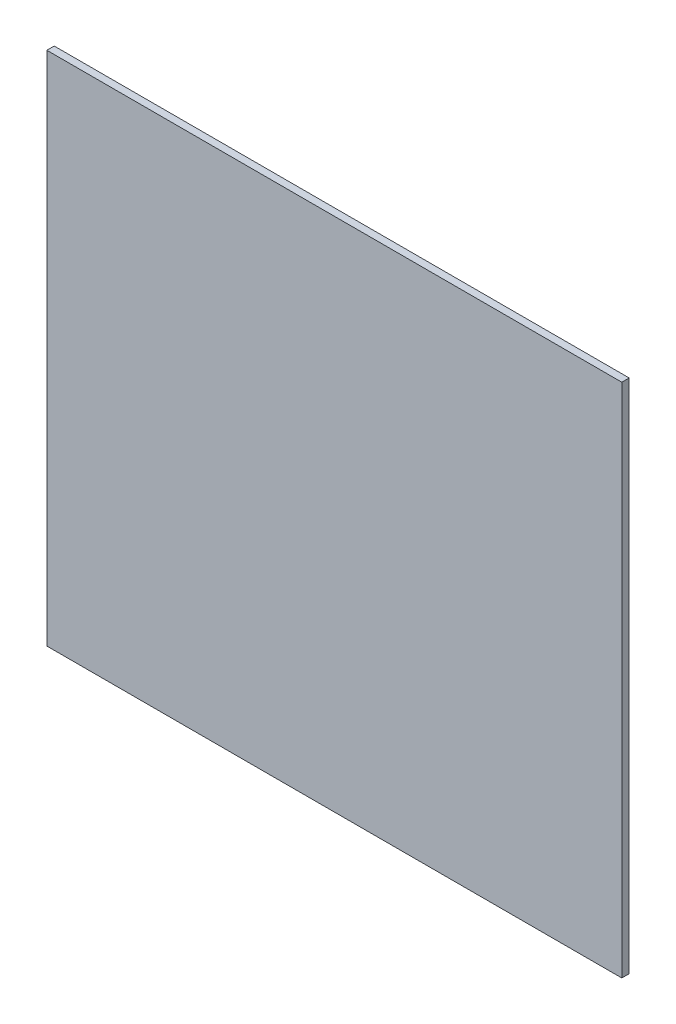
ISO-10303-21;
HEADER;
FILE_DESCRIPTION(('STEP AP214'),'2;1');
FILE_NAME('part.step','',(''),(''),'','','');
FILE_SCHEMA(('AUTOMOTIVE_DESIGN { 1 0 10303 214 1 1 1 1 }'));
ENDSEC;
DATA;
#1=APPLICATION_CONTEXT('core data for automotive mechanical design processes');
#2=APPLICATION_PROTOCOL_DEFINITION('international standard','automotive_design',2000,#1);
#3=PRODUCT_CONTEXT('',#1,'mechanical');
#4=PRODUCT('Part','Part','',(#3));
#5=PRODUCT_RELATED_PRODUCT_CATEGORY('part','',(#4));
#6=PRODUCT_DEFINITION_FORMATION('','',#4);
#7=PRODUCT_DEFINITION_CONTEXT('part definition',#1,'design');
#8=PRODUCT_DEFINITION('design','',#6,#7);
#9=PRODUCT_DEFINITION_SHAPE('','',#8);
#10=(LENGTH_UNIT() NAMED_UNIT(*) SI_UNIT(.MILLI.,.METRE.));
#11=(NAMED_UNIT(*) PLANE_ANGLE_UNIT() SI_UNIT($,.RADIAN.));
#12=(NAMED_UNIT(*) SI_UNIT($,.STERADIAN.) SOLID_ANGLE_UNIT());
#13=UNCERTAINTY_MEASURE_WITH_UNIT(LENGTH_MEASURE(1.E-05),#10,'distance_accuracy_value','');
#14=(GEOMETRIC_REPRESENTATION_CONTEXT(3) GLOBAL_UNCERTAINTY_ASSIGNED_CONTEXT((#13)) GLOBAL_UNIT_ASSIGNED_CONTEXT((#10,
#11,#12)) REPRESENTATION_CONTEXT('',''));
#15=CARTESIAN_POINT('',(0.,0.,0.));
#16=DIRECTION('',(0.,0.,1.));
#17=DIRECTION('',(1.,0.,0.));
#18=AXIS2_PLACEMENT_3D('',#15,#16,#17);
#19=CARTESIAN_POINT('',(-49.2125,55.5625,1.5875));
#20=DIRECTION('',(1.,0.,0.));
#21=DIRECTION('',(0.,0.,-1.));
#22=AXIS2_PLACEMENT_3D('',#19,#20,#21);
#23=PLANE('',#22);
#24=DIRECTION('',(0.,-1.,0.));
#25=VECTOR('',#24,1.);
#26=CARTESIAN_POINT('',(-49.2125,55.5625,0.));
#27=LINE('',#26,#25);
#28=CARTESIAN_POINT('',(-49.2125,55.5625,0.));
#29=VERTEX_POINT('',#28);
#30=CARTESIAN_POINT('',(-49.2125,-55.5625,0.));
#31=VERTEX_POINT('',#30);
#32=EDGE_CURVE('E73',#29,#31,#27,.T.);
#33=ORIENTED_EDGE('',*,*,#32,.T.);
#34=DIRECTION('',(0.,0.,-1.));
#35=VECTOR('',#34,1.);
#36=CARTESIAN_POINT('',(-49.2125,-55.5625,1.5875));
#37=LINE('',#36,#35);
#38=CARTESIAN_POINT('',(-49.2125,-55.5625,1.5875));
#39=VERTEX_POINT('',#38);
#40=EDGE_CURVE('E11',#39,#31,#37,.T.);
#41=ORIENTED_EDGE('',*,*,#40,.F.);
#42=DIRECTION('',(0.,-1.,0.));
#43=VECTOR('',#42,1.);
#44=CARTESIAN_POINT('',(-49.2125,55.5625,1.5875));
#45=LINE('',#44,#43);
#46=CARTESIAN_POINT('',(-49.2125,55.5625,1.5875));
#47=VERTEX_POINT('',#46);
#48=EDGE_CURVE('E91',#47,#39,#45,.T.);
#49=ORIENTED_EDGE('',*,*,#48,.F.);
#50=DIRECTION('',(0.,0.,-1.));
#51=VECTOR('',#50,1.);
#52=CARTESIAN_POINT('',(-49.2125,55.5625,1.5875));
#53=LINE('',#52,#51);
#54=EDGE_CURVE('E85',#47,#29,#53,.T.);
#55=ORIENTED_EDGE('',*,*,#54,.T.);
#56=EDGE_LOOP('',(#33,#41,#49,#55));
#57=FACE_BOUND('',#56,.T.);
#58=ADVANCED_FACE('F29',(#57),#23,.F.);
#59=CARTESIAN_POINT('',(-49.2125,-55.5625,1.5875));
#60=DIRECTION('',(0.,1.,0.));
#61=DIRECTION('',(0.,0.,1.));
#62=AXIS2_PLACEMENT_3D('',#59,#60,#61);
#63=PLANE('',#62);
#64=DIRECTION('',(1.,0.,0.));
#65=VECTOR('',#64,1.);
#66=CARTESIAN_POINT('',(-49.2125,-55.5625,0.));
#67=LINE('',#66,#65);
#68=CARTESIAN_POINT('',(74.6125,-55.5625,0.));
#69=VERTEX_POINT('',#68);
#70=EDGE_CURVE('E69',#31,#69,#67,.T.);
#71=ORIENTED_EDGE('',*,*,#70,.T.);
#72=DIRECTION('',(0.,0.,-1.));
#73=VECTOR('',#72,1.);
#74=CARTESIAN_POINT('',(74.6125,-55.5625,1.5875));
#75=LINE('',#74,#73);
#76=CARTESIAN_POINT('',(74.6125,-55.5625,1.5875));
#77=VERTEX_POINT('',#76);
#78=EDGE_CURVE('E36',#77,#69,#75,.T.);
#79=ORIENTED_EDGE('',*,*,#78,.F.);
#80=DIRECTION('',(1.,0.,0.));
#81=VECTOR('',#80,1.);
#82=CARTESIAN_POINT('',(-49.2125,-55.5625,1.5875));
#83=LINE('',#82,#81);
#84=EDGE_CURVE('E81',#39,#77,#83,.T.);
#85=ORIENTED_EDGE('',*,*,#84,.F.);
#86=ORIENTED_EDGE('',*,*,#40,.T.);
#87=EDGE_LOOP('',(#71,#79,#85,#86));
#88=FACE_BOUND('',#87,.T.);
#89=ADVANCED_FACE('F80',(#88),#63,.F.);
#90=CARTESIAN_POINT('',(74.6125,55.5625,1.5875));
#91=DIRECTION('',(-1.,0.,0.));
#92=DIRECTION('',(0.,0.,1.));
#93=AXIS2_PLACEMENT_3D('',#90,#91,#92);
#94=PLANE('',#93);
#95=DIRECTION('',(0.,1.,0.));
#96=VECTOR('',#95,1.);
#97=CARTESIAN_POINT('',(74.6125,55.5625,0.));
#98=LINE('',#97,#96);
#99=CARTESIAN_POINT('',(74.6125,55.5625,0.));
#100=VERTEX_POINT('',#99);
#101=EDGE_CURVE('E74',#69,#100,#98,.T.);
#102=ORIENTED_EDGE('',*,*,#101,.T.);
#103=DIRECTION('',(0.,0.,-1.));
#104=VECTOR('',#103,1.);
#105=CARTESIAN_POINT('',(74.6125,55.5625,1.5875));
#106=LINE('',#105,#104);
#107=CARTESIAN_POINT('',(74.6125,55.5625,1.5875));
#108=VERTEX_POINT('',#107);
#109=EDGE_CURVE('E97',#108,#100,#106,.T.);
#110=ORIENTED_EDGE('',*,*,#109,.F.);
#111=DIRECTION('',(0.,1.,0.));
#112=VECTOR('',#111,1.);
#113=CARTESIAN_POINT('',(74.6125,55.5625,1.5875));
#114=LINE('',#113,#112);
#115=EDGE_CURVE('E48',#77,#108,#114,.T.);
#116=ORIENTED_EDGE('',*,*,#115,.F.);
#117=ORIENTED_EDGE('',*,*,#78,.T.);
#118=EDGE_LOOP('',(#102,#110,#116,#117));
#119=FACE_BOUND('',#118,.T.);
#120=ADVANCED_FACE('F100',(#119),#94,.F.);
#121=CARTESIAN_POINT('',(-49.2125,55.5625,1.5875));
#122=DIRECTION('',(0.,-1.,0.));
#123=DIRECTION('',(0.,0.,-1.));
#124=AXIS2_PLACEMENT_3D('',#121,#122,#123);
#125=PLANE('',#124);
#126=DIRECTION('',(-1.,0.,0.));
#127=VECTOR('',#126,1.);
#128=CARTESIAN_POINT('',(-49.2125,55.5625,0.));
#129=LINE('',#128,#127);
#130=EDGE_CURVE('E89',#100,#29,#129,.T.);
#131=ORIENTED_EDGE('',*,*,#130,.T.);
#132=ORIENTED_EDGE('',*,*,#54,.F.);
#133=DIRECTION('',(-1.,0.,0.));
#134=VECTOR('',#133,1.);
#135=CARTESIAN_POINT('',(-49.2125,55.5625,1.5875));
#136=LINE('',#135,#134);
#137=EDGE_CURVE('E43',#108,#47,#136,.T.);
#138=ORIENTED_EDGE('',*,*,#137,.F.);
#139=ORIENTED_EDGE('',*,*,#109,.T.);
#140=EDGE_LOOP('',(#131,#132,#138,#139));
#141=FACE_BOUND('',#140,.T.);
#142=ADVANCED_FACE('F102',(#141),#125,.F.);
#143=CARTESIAN_POINT('',(-49.2125,-55.5625,1.5875));
#144=DIRECTION('',(0.,0.,1.));
#145=DIRECTION('',(1.,0.,0.));
#146=AXIS2_PLACEMENT_3D('',#143,#144,#145);
#147=PLANE('',#146);
#148=ORIENTED_EDGE('',*,*,#48,.T.);
#149=ORIENTED_EDGE('',*,*,#84,.T.);
#150=ORIENTED_EDGE('',*,*,#115,.T.);
#151=ORIENTED_EDGE('',*,*,#137,.T.);
#152=EDGE_LOOP('',(#148,#149,#150,#151));
#153=FACE_BOUND('',#152,.T.);
#154=ADVANCED_FACE('F103',(#153),#147,.T.);
#155=CARTESIAN_POINT('',(-49.2125,-55.5625,0.));
#156=DIRECTION('',(0.,0.,1.));
#157=DIRECTION('',(1.,0.,0.));
#158=AXIS2_PLACEMENT_3D('',#155,#156,#157);
#159=PLANE('',#158);
#160=ORIENTED_EDGE('',*,*,#32,.F.);
#161=ORIENTED_EDGE('',*,*,#130,.F.);
#162=ORIENTED_EDGE('',*,*,#101,.F.);
#163=ORIENTED_EDGE('',*,*,#70,.F.);
#164=EDGE_LOOP('',(#160,#161,#162,#163));
#165=FACE_BOUND('',#164,.T.);
#166=ADVANCED_FACE('F70',(#165),#159,.F.);
#167=CLOSED_SHELL('',(#58,#89,#120,#142,#154,#166));
#168=MANIFOLD_SOLID_BREP('B2',#167);
#169=ADVANCED_BREP_SHAPE_REPRESENTATION('',(#18,#168),#14);
#170=SHAPE_DEFINITION_REPRESENTATION(#9,#169);
ENDSEC;
END-ISO-10303-21;
